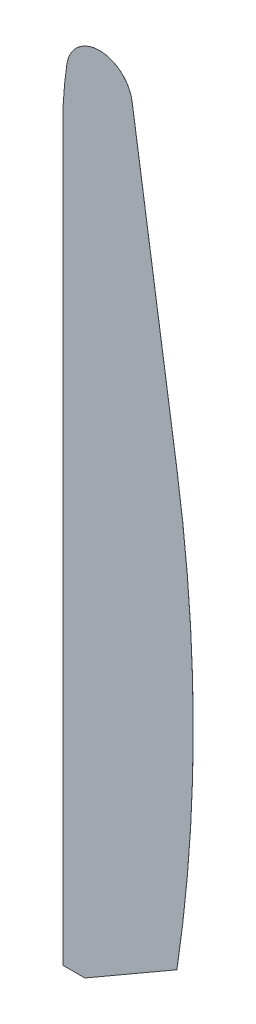
ISO-10303-21;
HEADER;
FILE_DESCRIPTION(('STEP AP214'),'2;1');
FILE_NAME('part.step','',(''),(''),'','','');
FILE_SCHEMA(('AUTOMOTIVE_DESIGN { 1 0 10303 214 1 1 1 1 }'));
ENDSEC;
DATA;
#1=APPLICATION_CONTEXT('core data for automotive mechanical design processes');
#2=APPLICATION_PROTOCOL_DEFINITION('international standard','automotive_design',2000,#1);
#3=PRODUCT_CONTEXT('',#1,'mechanical');
#4=PRODUCT('Part','Part','',(#3));
#5=PRODUCT_RELATED_PRODUCT_CATEGORY('part','',(#4));
#6=PRODUCT_DEFINITION_FORMATION('','',#4);
#7=PRODUCT_DEFINITION_CONTEXT('part definition',#1,'design');
#8=PRODUCT_DEFINITION('design','',#6,#7);
#9=PRODUCT_DEFINITION_SHAPE('','',#8);
#10=(LENGTH_UNIT() NAMED_UNIT(*) SI_UNIT(.MILLI.,.METRE.));
#11=(NAMED_UNIT(*) PLANE_ANGLE_UNIT() SI_UNIT($,.RADIAN.));
#12=(NAMED_UNIT(*) SI_UNIT($,.STERADIAN.) SOLID_ANGLE_UNIT());
#13=UNCERTAINTY_MEASURE_WITH_UNIT(LENGTH_MEASURE(1.E-05),#10,'distance_accuracy_value','');
#14=(GEOMETRIC_REPRESENTATION_CONTEXT(3) GLOBAL_UNCERTAINTY_ASSIGNED_CONTEXT((#13)) GLOBAL_UNIT_ASSIGNED_CONTEXT((#10,
#11,#12)) REPRESENTATION_CONTEXT('',''));
#15=CARTESIAN_POINT('',(0.,0.,0.));
#16=DIRECTION('',(0.,0.,1.));
#17=DIRECTION('',(1.,0.,0.));
#18=AXIS2_PLACEMENT_3D('',#15,#16,#17);
#19=CARTESIAN_POINT('',(8.33059546702411,176.380853670003,0.01));
#20=DIRECTION('',(0.,0.,-1.));
#21=DIRECTION('',(-1.,0.,0.));
#22=AXIS2_PLACEMENT_3D('',#19,#20,#21);
#23=CYLINDRICAL_SURFACE('',#22,7.48002935839017);
#24=CARTESIAN_POINT('',(8.33059546702411,176.380853670003,0.));
#25=DIRECTION('',(0.,0.,-1.));
#26=DIRECTION('',(-1.,0.,0.));
#27=AXIS2_PLACEMENT_3D('',#24,#25,#26);
#28=CIRCLE('',#27,7.48002935839017);
#29=CARTESIAN_POINT('',(0.934762133691619,177.5,0.));
#30=VERTEX_POINT('',#29);
#31=CARTESIAN_POINT('',(15.7264288003566,177.5,0.));
#32=VERTEX_POINT('',#31);
#33=EDGE_CURVE('E130',#30,#32,#28,.T.);
#34=ORIENTED_EDGE('',*,*,#33,.F.);
#35=DIRECTION('',(0.,0.,-1.));
#36=VECTOR('',#35,1.);
#37=CARTESIAN_POINT('',(0.934762133691619,177.5,0.01));
#38=LINE('',#37,#36);
#39=CARTESIAN_POINT('',(0.934762133691619,177.5,0.01));
#40=VERTEX_POINT('',#39);
#41=EDGE_CURVE('E11',#40,#30,#38,.T.);
#42=ORIENTED_EDGE('',*,*,#41,.F.);
#43=CARTESIAN_POINT('',(8.33059546702411,176.380853670003,0.01));
#44=DIRECTION('',(0.,0.,-1.));
#45=DIRECTION('',(-1.,0.,0.));
#46=AXIS2_PLACEMENT_3D('',#43,#44,#45);
#47=CIRCLE('',#46,7.48002935839017);
#48=CARTESIAN_POINT('',(15.7264288003566,177.5,0.01));
#49=VERTEX_POINT('',#48);
#50=EDGE_CURVE('E141',#40,#49,#47,.T.);
#51=ORIENTED_EDGE('',*,*,#50,.T.);
#52=DIRECTION('',(0.,0.,-1.));
#53=VECTOR('',#52,1.);
#54=CARTESIAN_POINT('',(15.7264288003566,177.5,0.01));
#55=LINE('',#54,#53);
#56=EDGE_CURVE('E45',#49,#32,#55,.T.);
#57=ORIENTED_EDGE('',*,*,#56,.T.);
#58=EDGE_LOOP('',(#34,#42,#51,#57));
#59=FACE_BOUND('',#58,.T.);
#60=ADVANCED_FACE('F39',(#59),#23,.T.);
#61=CARTESIAN_POINT('',(83.0448729418699,165.075,0.01));
#62=DIRECTION('',(0.,0.,-1.));
#63=DIRECTION('',(-1.,0.,0.));
#64=AXIS2_PLACEMENT_3D('',#61,#62,#63);
#65=CYLINDRICAL_SURFACE('',#64,83.0448729418699);
#66=CARTESIAN_POINT('',(83.0448729418699,165.075,0.));
#67=DIRECTION('',(0.,0.,-1.));
#68=DIRECTION('',(-1.,0.,0.));
#69=AXIS2_PLACEMENT_3D('',#66,#67,#68);
#70=CIRCLE('',#69,83.0448729418699);
#71=CARTESIAN_POINT('',(0.,165.075,0.));
#72=VERTEX_POINT('',#71);
#73=EDGE_CURVE('E143',#72,#30,#70,.T.);
#74=ORIENTED_EDGE('',*,*,#73,.F.);
#75=DIRECTION('',(0.,0.,-1.));
#76=VECTOR('',#75,1.);
#77=CARTESIAN_POINT('',(0.,165.075,0.01));
#78=LINE('',#77,#76);
#79=CARTESIAN_POINT('',(0.,165.075,0.01));
#80=VERTEX_POINT('',#79);
#81=EDGE_CURVE('E48',#80,#72,#78,.T.);
#82=ORIENTED_EDGE('',*,*,#81,.F.);
#83=CARTESIAN_POINT('',(83.0448729418699,165.075,0.01));
#84=DIRECTION('',(0.,0.,-1.));
#85=DIRECTION('',(-1.,0.,0.));
#86=AXIS2_PLACEMENT_3D('',#83,#84,#85);
#87=CIRCLE('',#86,83.0448729418699);
#88=EDGE_CURVE('E125',#80,#40,#87,.T.);
#89=ORIENTED_EDGE('',*,*,#88,.T.);
#90=ORIENTED_EDGE('',*,*,#41,.T.);
#91=EDGE_LOOP('',(#74,#82,#89,#90));
#92=FACE_BOUND('',#91,.T.);
#93=ADVANCED_FACE('F154',(#92),#65,.T.);
#94=CARTESIAN_POINT('',(0.,0.,0.01));
#95=DIRECTION('',(-1.,0.,0.));
#96=DIRECTION('',(0.,0.,1.));
#97=AXIS2_PLACEMENT_3D('',#94,#95,#96);
#98=PLANE('',#97);
#99=DIRECTION('',(0.,1.,0.));
#100=VECTOR('',#99,1.);
#101=CARTESIAN_POINT('',(0.,0.,0.));
#102=LINE('',#101,#100);
#103=CARTESIAN_POINT('',(0.,0.,0.));
#104=VERTEX_POINT('',#103);
#105=EDGE_CURVE('E107',#104,#72,#102,.T.);
#106=ORIENTED_EDGE('',*,*,#105,.F.);
#107=DIRECTION('',(0.,0.,-1.));
#108=VECTOR('',#107,1.);
#109=CARTESIAN_POINT('',(0.,0.,0.01));
#110=LINE('',#109,#108);
#111=CARTESIAN_POINT('',(0.,0.,0.01));
#112=VERTEX_POINT('',#111);
#113=EDGE_CURVE('E105',#112,#104,#110,.T.);
#114=ORIENTED_EDGE('',*,*,#113,.F.);
#115=DIRECTION('',(0.,1.,0.));
#116=VECTOR('',#115,1.);
#117=CARTESIAN_POINT('',(0.,0.,0.01));
#118=LINE('',#117,#116);
#119=EDGE_CURVE('E106',#112,#80,#118,.T.);
#120=ORIENTED_EDGE('',*,*,#119,.T.);
#121=ORIENTED_EDGE('',*,*,#81,.T.);
#122=EDGE_LOOP('',(#106,#114,#120,#121));
#123=FACE_BOUND('',#122,.T.);
#124=ADVANCED_FACE('F102',(#123),#98,.T.);
#125=CARTESIAN_POINT('',(0.,0.,0.01));
#126=DIRECTION('',(0.,1.,0.));
#127=DIRECTION('',(-1.,0.,0.));
#128=AXIS2_PLACEMENT_3D('',#125,#126,#127);
#129=PLANE('',#128);
#130=DIRECTION('',(1.,0.,0.));
#131=VECTOR('',#130,1.);
#132=CARTESIAN_POINT('',(0.,0.,0.));
#133=LINE('',#132,#131);
#134=CARTESIAN_POINT('',(5.,0.,0.));
#135=VERTEX_POINT('',#134);
#136=EDGE_CURVE('E136',#104,#135,#133,.T.);
#137=ORIENTED_EDGE('',*,*,#136,.T.);
#138=DIRECTION('',(0.,0.,-1.));
#139=VECTOR('',#138,1.);
#140=CARTESIAN_POINT('',(5.,0.,0.01));
#141=LINE('',#140,#139);
#142=CARTESIAN_POINT('',(5.,0.,0.01));
#143=VERTEX_POINT('',#142);
#144=EDGE_CURVE('E112',#143,#135,#141,.T.);
#145=ORIENTED_EDGE('',*,*,#144,.F.);
#146=DIRECTION('',(1.,0.,0.));
#147=VECTOR('',#146,1.);
#148=CARTESIAN_POINT('',(0.,0.,0.01));
#149=LINE('',#148,#147);
#150=EDGE_CURVE('E111',#112,#143,#149,.T.);
#151=ORIENTED_EDGE('',*,*,#150,.F.);
#152=ORIENTED_EDGE('',*,*,#113,.T.);
#153=EDGE_LOOP('',(#137,#145,#151,#152));
#154=FACE_BOUND('',#153,.T.);
#155=ADVANCED_FACE('F113',(#154),#129,.F.);
#156=CARTESIAN_POINT('',(5.,0.,0.01));
#157=DIRECTION('',(-0.500000000000001,0.866025403784438,0.));
#158=DIRECTION('',(-0.866025403784438,-0.500000000000001,0.));
#159=AXIS2_PLACEMENT_3D('',#156,#157,#158);
#160=PLANE('',#159);
#161=DIRECTION('',(0.866025403784438,0.500000000000001,0.));
#162=VECTOR('',#161,1.);
#163=CARTESIAN_POINT('',(5.,0.,0.));
#164=LINE('',#163,#162);
#165=CARTESIAN_POINT('',(25.8854166666637,12.0582009346357,0.));
#166=VERTEX_POINT('',#165);
#167=EDGE_CURVE('E138',#135,#166,#164,.T.);
#168=ORIENTED_EDGE('',*,*,#167,.T.);
#169=DIRECTION('',(0.,0.,-1.));
#170=VECTOR('',#169,1.);
#171=CARTESIAN_POINT('',(25.8854166666637,12.0582009346357,0.01));
#172=LINE('',#171,#170);
#173=CARTESIAN_POINT('',(25.8854166666637,12.0582009346357,0.01));
#174=VERTEX_POINT('',#173);
#175=EDGE_CURVE('E150',#174,#166,#172,.T.);
#176=ORIENTED_EDGE('',*,*,#175,.F.);
#177=DIRECTION('',(0.866025403784438,0.500000000000001,0.));
#178=VECTOR('',#177,1.);
#179=CARTESIAN_POINT('',(5.,0.,0.01));
#180=LINE('',#179,#178);
#181=EDGE_CURVE('E116',#143,#174,#180,.T.);
#182=ORIENTED_EDGE('',*,*,#181,.F.);
#183=ORIENTED_EDGE('',*,*,#144,.T.);
#184=EDGE_LOOP('',(#168,#176,#182,#183));
#185=FACE_BOUND('',#184,.T.);
#186=ADVANCED_FACE('F169',(#185),#160,.F.);
#187=CARTESIAN_POINT('',(-298.941976651592,61.2114699079049,0.01));
#188=DIRECTION('',(0.,0.,-1.));
#189=DIRECTION('',(-1.,0.,0.));
#190=AXIS2_PLACEMENT_3D('',#187,#188,#189);
#191=CYLINDRICAL_SURFACE('',#190,328.525309984925);
#192=CARTESIAN_POINT('',(-298.941976651592,61.2114699079049,0.));
#193=DIRECTION('',(0.,0.,1.));
#194=DIRECTION('',(1.,0.,0.));
#195=AXIS2_PLACEMENT_3D('',#192,#193,#194);
#196=CIRCLE('',#195,328.525309984925);
#197=CARTESIAN_POINT('',(25.8854166666637,110.364738881174,0.));
#198=VERTEX_POINT('',#197);
#199=EDGE_CURVE('E134',#166,#198,#196,.T.);
#200=ORIENTED_EDGE('',*,*,#199,.T.);
#201=DIRECTION('',(0.,0.,-1.));
#202=VECTOR('',#201,1.);
#203=CARTESIAN_POINT('',(25.8854166666637,110.364738881174,0.01));
#204=LINE('',#203,#202);
#205=CARTESIAN_POINT('',(25.8854166666637,110.364738881174,0.01));
#206=VERTEX_POINT('',#205);
#207=EDGE_CURVE('E149',#206,#198,#204,.T.);
#208=ORIENTED_EDGE('',*,*,#207,.F.);
#209=CARTESIAN_POINT('',(-298.941976651592,61.2114699079049,0.01));
#210=DIRECTION('',(0.,0.,1.));
#211=DIRECTION('',(1.,0.,0.));
#212=AXIS2_PLACEMENT_3D('',#209,#210,#211);
#213=CIRCLE('',#212,328.525309984925);
#214=EDGE_CURVE('E231',#174,#206,#213,.T.);
#215=ORIENTED_EDGE('',*,*,#214,.F.);
#216=ORIENTED_EDGE('',*,*,#175,.T.);
#217=EDGE_LOOP('',(#200,#208,#215,#216));
#218=FACE_BOUND('',#217,.T.);
#219=ADVANCED_FACE('F172',(#218),#191,.T.);
#220=CARTESIAN_POINT('',(15.7264288003566,177.5,0.01));
#221=DIRECTION('',(0.988743891096733,0.149617906077084,0.));
#222=DIRECTION('',(-0.149617906077084,0.988743891096733,0.));
#223=AXIS2_PLACEMENT_3D('',#220,#221,#222);
#224=PLANE('',#223);
#225=DIRECTION('',(0.149617906077084,-0.988743891096733,0.));
#226=VECTOR('',#225,1.);
#227=CARTESIAN_POINT('',(15.7264288003566,177.5,0.));
#228=LINE('',#227,#226);
#229=EDGE_CURVE('E128',#32,#198,#228,.T.);
#230=ORIENTED_EDGE('',*,*,#229,.F.);
#231=ORIENTED_EDGE('',*,*,#56,.F.);
#232=DIRECTION('',(0.149617906077084,-0.988743891096733,0.));
#233=VECTOR('',#232,1.);
#234=CARTESIAN_POINT('',(15.7264288003566,177.5,0.01));
#235=LINE('',#234,#233);
#236=EDGE_CURVE('E234',#49,#206,#235,.T.);
#237=ORIENTED_EDGE('',*,*,#236,.T.);
#238=ORIENTED_EDGE('',*,*,#207,.T.);
#239=EDGE_LOOP('',(#230,#231,#237,#238));
#240=FACE_BOUND('',#239,.T.);
#241=ADVANCED_FACE('F151',(#240),#224,.T.);
#242=CARTESIAN_POINT('',(8.33059546702411,176.380853670003,0.01));
#243=DIRECTION('',(0.,0.,-1.));
#244=DIRECTION('',(-1.,0.,0.));
#245=AXIS2_PLACEMENT_3D('',#242,#243,#244);
#246=PLANE('',#245);
#247=ORIENTED_EDGE('',*,*,#50,.F.);
#248=ORIENTED_EDGE('',*,*,#88,.F.);
#249=ORIENTED_EDGE('',*,*,#119,.F.);
#250=ORIENTED_EDGE('',*,*,#150,.T.);
#251=ORIENTED_EDGE('',*,*,#181,.T.);
#252=ORIENTED_EDGE('',*,*,#214,.T.);
#253=ORIENTED_EDGE('',*,*,#236,.F.);
#254=EDGE_LOOP('',(#247,#248,#249,#250,#251,#252,#253));
#255=FACE_BOUND('',#254,.T.);
#256=ADVANCED_FACE('F123',(#255),#246,.F.);
#257=CARTESIAN_POINT('',(8.33059546702411,176.380853670003,0.));
#258=DIRECTION('',(0.,0.,-1.));
#259=DIRECTION('',(-1.,0.,0.));
#260=AXIS2_PLACEMENT_3D('',#257,#258,#259);
#261=PLANE('',#260);
#262=ORIENTED_EDGE('',*,*,#33,.T.);
#263=ORIENTED_EDGE('',*,*,#229,.T.);
#264=ORIENTED_EDGE('',*,*,#199,.F.);
#265=ORIENTED_EDGE('',*,*,#167,.F.);
#266=ORIENTED_EDGE('',*,*,#136,.F.);
#267=ORIENTED_EDGE('',*,*,#105,.T.);
#268=ORIENTED_EDGE('',*,*,#73,.T.);
#269=EDGE_LOOP('',(#262,#263,#264,#265,#266,#267,#268));
#270=FACE_BOUND('',#269,.T.);
#271=ADVANCED_FACE('F152',(#270),#261,.T.);
#272=CLOSED_SHELL('',(#60,#93,#124,#155,#186,#219,#241,#256,#271));
#273=MANIFOLD_SOLID_BREP('B2',#272);
#274=ADVANCED_BREP_SHAPE_REPRESENTATION('',(#18,#273),#14);
#275=SHAPE_DEFINITION_REPRESENTATION(#9,#274);
ENDSEC;
END-ISO-10303-21;
